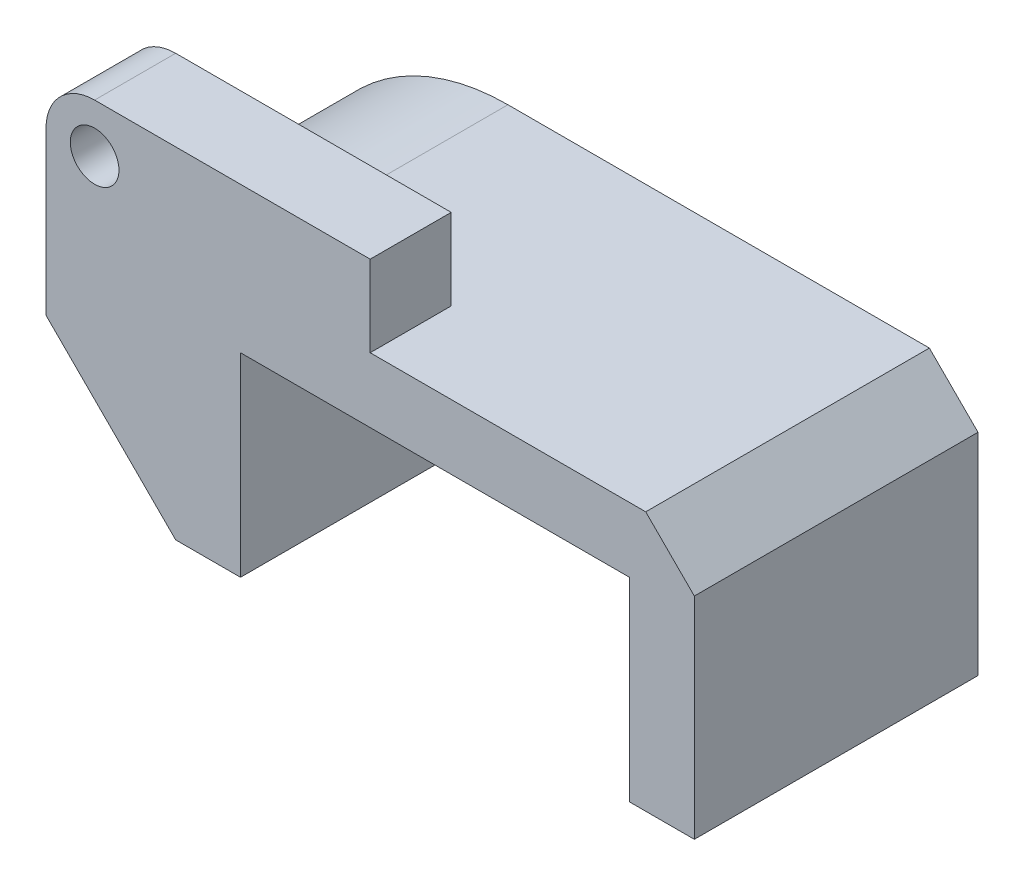
ISO-10303-21;
HEADER;
FILE_DESCRIPTION(('STEP AP214'),'2;1');
FILE_NAME('part.step','',(''),(''),'','','');
FILE_SCHEMA(('AUTOMOTIVE_DESIGN { 1 0 10303 214 1 1 1 1 }'));
ENDSEC;
DATA;
#1=APPLICATION_CONTEXT('core data for automotive mechanical design processes');
#2=APPLICATION_PROTOCOL_DEFINITION('international standard','automotive_design',2000,#1);
#3=PRODUCT_CONTEXT('',#1,'mechanical');
#4=PRODUCT('Part','Part','',(#3));
#5=PRODUCT_RELATED_PRODUCT_CATEGORY('part','',(#4));
#6=PRODUCT_DEFINITION_FORMATION('','',#4);
#7=PRODUCT_DEFINITION_CONTEXT('part definition',#1,'design');
#8=PRODUCT_DEFINITION('design','',#6,#7);
#9=PRODUCT_DEFINITION_SHAPE('','',#8);
#10=(LENGTH_UNIT() NAMED_UNIT(*) SI_UNIT(.MILLI.,.METRE.));
#11=(NAMED_UNIT(*) PLANE_ANGLE_UNIT() SI_UNIT($,.RADIAN.));
#12=(NAMED_UNIT(*) SI_UNIT($,.STERADIAN.) SOLID_ANGLE_UNIT());
#13=UNCERTAINTY_MEASURE_WITH_UNIT(LENGTH_MEASURE(1.E-05),#10,'distance_accuracy_value','');
#14=(GEOMETRIC_REPRESENTATION_CONTEXT(3) GLOBAL_UNCERTAINTY_ASSIGNED_CONTEXT((#13)) GLOBAL_UNIT_ASSIGNED_CONTEXT((#10,
#11,#12)) REPRESENTATION_CONTEXT('',''));
#15=CARTESIAN_POINT('',(0.,0.,0.));
#16=DIRECTION('',(0.,0.,1.));
#17=DIRECTION('',(1.,0.,0.));
#18=AXIS2_PLACEMENT_3D('',#15,#16,#17);
#19=CARTESIAN_POINT('',(-16.,-12.,17.5));
#20=DIRECTION('',(0.,1.,0.));
#21=DIRECTION('',(0.,0.,1.));
#22=AXIS2_PLACEMENT_3D('',#19,#20,#21);
#23=PLANE('',#22);
#24=DIRECTION('',(1.,0.,0.));
#25=VECTOR('',#24,1.);
#26=CARTESIAN_POINT('',(-16.,-12.,17.5));
#27=LINE('',#26,#25);
#28=CARTESIAN_POINT('',(-16.,-12.,17.5));
#29=VERTEX_POINT('',#28);
#30=CARTESIAN_POINT('',(-12.,-12.,17.5));
#31=VERTEX_POINT('',#30);
#32=EDGE_CURVE('E206',#29,#31,#27,.T.);
#33=ORIENTED_EDGE('',*,*,#32,.F.);
#34=DIRECTION('',(0.,0.,-1.));
#35=VECTOR('',#34,1.);
#36=CARTESIAN_POINT('',(-16.,-12.,17.5));
#37=LINE('',#36,#35);
#38=CARTESIAN_POINT('',(-16.,-12.,0.));
#39=VERTEX_POINT('',#38);
#40=EDGE_CURVE('E251',#29,#39,#37,.T.);
#41=ORIENTED_EDGE('',*,*,#40,.T.);
#42=DIRECTION('',(1.,0.,0.));
#43=VECTOR('',#42,1.);
#44=CARTESIAN_POINT('',(-16.,-12.,0.));
#45=LINE('',#44,#43);
#46=CARTESIAN_POINT('',(-12.,-12.,0.));
#47=VERTEX_POINT('',#46);
#48=EDGE_CURVE('E156',#39,#47,#45,.T.);
#49=ORIENTED_EDGE('',*,*,#48,.T.);
#50=DIRECTION('',(0.,0.,-1.));
#51=VECTOR('',#50,1.);
#52=CARTESIAN_POINT('',(-12.,-12.,17.5));
#53=LINE('',#52,#51);
#54=EDGE_CURVE('E248',#31,#47,#53,.T.);
#55=ORIENTED_EDGE('',*,*,#54,.F.);
#56=EDGE_LOOP('',(#33,#41,#49,#55));
#57=FACE_BOUND('',#56,.T.);
#58=ADVANCED_FACE('F32',(#57),#23,.F.);
#59=CARTESIAN_POINT('',(-12.,-12.,17.5));
#60=DIRECTION('',(-1.,0.,0.));
#61=DIRECTION('',(0.,0.,1.));
#62=AXIS2_PLACEMENT_3D('',#59,#60,#61);
#63=PLANE('',#62);
#64=DIRECTION('',(0.,1.,0.));
#65=VECTOR('',#64,1.);
#66=CARTESIAN_POINT('',(-12.,-12.,0.));
#67=LINE('',#66,#65);
#68=CARTESIAN_POINT('',(-12.,0.,0.));
#69=VERTEX_POINT('',#68);
#70=EDGE_CURVE('E225',#47,#69,#67,.T.);
#71=ORIENTED_EDGE('',*,*,#70,.T.);
#72=DIRECTION('',(0.,0.,-1.));
#73=VECTOR('',#72,1.);
#74=CARTESIAN_POINT('',(-12.,0.,17.5));
#75=LINE('',#74,#73);
#76=CARTESIAN_POINT('',(-12.,0.,17.5));
#77=VERTEX_POINT('',#76);
#78=EDGE_CURVE('E245',#77,#69,#75,.T.);
#79=ORIENTED_EDGE('',*,*,#78,.F.);
#80=DIRECTION('',(0.,1.,0.));
#81=VECTOR('',#80,1.);
#82=CARTESIAN_POINT('',(-12.,-12.,17.5));
#83=LINE('',#82,#81);
#84=EDGE_CURVE('E208',#31,#77,#83,.T.);
#85=ORIENTED_EDGE('',*,*,#84,.F.);
#86=ORIENTED_EDGE('',*,*,#54,.T.);
#87=EDGE_LOOP('',(#71,#79,#85,#86));
#88=FACE_BOUND('',#87,.T.);
#89=ADVANCED_FACE('F321',(#88),#63,.F.);
#90=CARTESIAN_POINT('',(-12.,0.,17.5));
#91=DIRECTION('',(0.,1.,0.));
#92=DIRECTION('',(0.,0.,1.));
#93=AXIS2_PLACEMENT_3D('',#90,#91,#92);
#94=PLANE('',#93);
#95=DIRECTION('',(1.,0.,0.));
#96=VECTOR('',#95,1.);
#97=CARTESIAN_POINT('',(-12.,0.,0.));
#98=LINE('',#97,#96);
#99=CARTESIAN_POINT('',(12.,0.,0.));
#100=VERTEX_POINT('',#99);
#101=EDGE_CURVE('E227',#69,#100,#98,.T.);
#102=ORIENTED_EDGE('',*,*,#101,.T.);
#103=DIRECTION('',(0.,0.,-1.));
#104=VECTOR('',#103,1.);
#105=CARTESIAN_POINT('',(12.,0.,17.5));
#106=LINE('',#105,#104);
#107=CARTESIAN_POINT('',(12.,0.,17.5));
#108=VERTEX_POINT('',#107);
#109=EDGE_CURVE('E242',#108,#100,#106,.T.);
#110=ORIENTED_EDGE('',*,*,#109,.F.);
#111=DIRECTION('',(1.,0.,0.));
#112=VECTOR('',#111,1.);
#113=CARTESIAN_POINT('',(-12.,0.,17.5));
#114=LINE('',#113,#112);
#115=EDGE_CURVE('E211',#77,#108,#114,.T.);
#116=ORIENTED_EDGE('',*,*,#115,.F.);
#117=ORIENTED_EDGE('',*,*,#78,.T.);
#118=EDGE_LOOP('',(#102,#110,#116,#117));
#119=FACE_BOUND('',#118,.T.);
#120=ADVANCED_FACE('F317',(#119),#94,.F.);
#121=CARTESIAN_POINT('',(12.,-12.,17.5));
#122=DIRECTION('',(1.,0.,0.));
#123=DIRECTION('',(0.,0.,-1.));
#124=AXIS2_PLACEMENT_3D('',#121,#122,#123);
#125=PLANE('',#124);
#126=DIRECTION('',(0.,-1.,0.));
#127=VECTOR('',#126,1.);
#128=CARTESIAN_POINT('',(12.,-12.,0.));
#129=LINE('',#128,#127);
#130=CARTESIAN_POINT('',(12.,-12.,0.));
#131=VERTEX_POINT('',#130);
#132=EDGE_CURVE('E229',#100,#131,#129,.T.);
#133=ORIENTED_EDGE('',*,*,#132,.T.);
#134=DIRECTION('',(0.,0.,-1.));
#135=VECTOR('',#134,1.);
#136=CARTESIAN_POINT('',(12.,-12.,17.5));
#137=LINE('',#136,#135);
#138=CARTESIAN_POINT('',(12.,-12.,17.5));
#139=VERTEX_POINT('',#138);
#140=EDGE_CURVE('E239',#139,#131,#137,.T.);
#141=ORIENTED_EDGE('',*,*,#140,.F.);
#142=DIRECTION('',(0.,-1.,0.));
#143=VECTOR('',#142,1.);
#144=CARTESIAN_POINT('',(12.,-12.,17.5));
#145=LINE('',#144,#143);
#146=EDGE_CURVE('E213',#108,#139,#145,.T.);
#147=ORIENTED_EDGE('',*,*,#146,.F.);
#148=ORIENTED_EDGE('',*,*,#109,.T.);
#149=EDGE_LOOP('',(#133,#141,#147,#148));
#150=FACE_BOUND('',#149,.T.);
#151=ADVANCED_FACE('F313',(#150),#125,.F.);
#152=CARTESIAN_POINT('',(12.,-12.,17.5));
#153=DIRECTION('',(0.,1.,0.));
#154=DIRECTION('',(0.,0.,1.));
#155=AXIS2_PLACEMENT_3D('',#152,#153,#154);
#156=PLANE('',#155);
#157=DIRECTION('',(1.,0.,0.));
#158=VECTOR('',#157,1.);
#159=CARTESIAN_POINT('',(12.,-12.,0.));
#160=LINE('',#159,#158);
#161=CARTESIAN_POINT('',(16.,-12.,0.));
#162=VERTEX_POINT('',#161);
#163=EDGE_CURVE('E231',#131,#162,#160,.T.);
#164=ORIENTED_EDGE('',*,*,#163,.T.);
#165=DIRECTION('',(0.,0.,-1.));
#166=VECTOR('',#165,1.);
#167=CARTESIAN_POINT('',(16.,-12.,17.5));
#168=LINE('',#167,#166);
#169=CARTESIAN_POINT('',(16.,-12.,17.5));
#170=VERTEX_POINT('',#169);
#171=EDGE_CURVE('E223',#170,#162,#168,.T.);
#172=ORIENTED_EDGE('',*,*,#171,.F.);
#173=DIRECTION('',(1.,0.,0.));
#174=VECTOR('',#173,1.);
#175=CARTESIAN_POINT('',(12.,-12.,17.5));
#176=LINE('',#175,#174);
#177=EDGE_CURVE('E215',#139,#170,#176,.T.);
#178=ORIENTED_EDGE('',*,*,#177,.F.);
#179=ORIENTED_EDGE('',*,*,#140,.T.);
#180=EDGE_LOOP('',(#164,#172,#178,#179));
#181=FACE_BOUND('',#180,.T.);
#182=ADVANCED_FACE('F309',(#181),#156,.F.);
#183=CARTESIAN_POINT('',(16.,4.,17.5));
#184=DIRECTION('',(-1.,0.,0.));
#185=DIRECTION('',(0.,0.,1.));
#186=AXIS2_PLACEMENT_3D('',#183,#184,#185);
#187=PLANE('',#186);
#188=DIRECTION('',(0.,1.,0.));
#189=VECTOR('',#188,1.);
#190=CARTESIAN_POINT('',(16.,4.,0.));
#191=LINE('',#190,#189);
#192=CARTESIAN_POINT('',(16.,0.99999999999999,0.));
#193=VERTEX_POINT('',#192);
#194=EDGE_CURVE('E233',#162,#193,#191,.T.);
#195=ORIENTED_EDGE('',*,*,#194,.T.);
#196=DIRECTION('',(0.,0.,1.));
#197=VECTOR('',#196,1.);
#198=CARTESIAN_POINT('',(16.,0.99999999999999,17.5));
#199=LINE('',#198,#197);
#200=CARTESIAN_POINT('',(16.,0.999999999999992,17.5));
#201=VERTEX_POINT('',#200);
#202=EDGE_CURVE('E261',#193,#201,#199,.T.);
#203=ORIENTED_EDGE('',*,*,#202,.T.);
#204=DIRECTION('',(0.,1.,0.));
#205=VECTOR('',#204,1.);
#206=CARTESIAN_POINT('',(16.,4.,17.5));
#207=LINE('',#206,#205);
#208=EDGE_CURVE('E217',#170,#201,#207,.T.);
#209=ORIENTED_EDGE('',*,*,#208,.F.);
#210=ORIENTED_EDGE('',*,*,#171,.T.);
#211=EDGE_LOOP('',(#195,#203,#209,#210));
#212=FACE_BOUND('',#211,.T.);
#213=ADVANCED_FACE('F300',(#212),#187,.F.);
#214=CARTESIAN_POINT('',(-16.,4.,17.5));
#215=DIRECTION('',(0.,-1.,0.));
#216=DIRECTION('',(0.,0.,-1.));
#217=AXIS2_PLACEMENT_3D('',#214,#215,#216);
#218=PLANE('',#217);
#219=DIRECTION('',(1.,0.,0.));
#220=VECTOR('',#219,1.);
#221=CARTESIAN_POINT('',(-16.,4.,12.5));
#222=LINE('',#221,#220);
#223=CARTESIAN_POINT('',(-13.,4.,12.5));
#224=VERTEX_POINT('',#223);
#225=CARTESIAN_POINT('',(-4.,4.,12.5));
#226=VERTEX_POINT('',#225);
#227=EDGE_CURVE('E200',#224,#226,#222,.T.);
#228=ORIENTED_EDGE('',*,*,#227,.T.);
#229=DIRECTION('',(0.,0.,1.));
#230=VECTOR('',#229,1.);
#231=CARTESIAN_POINT('',(-4.,4.,17.5));
#232=LINE('',#231,#230);
#233=CARTESIAN_POINT('',(-4.,4.,17.5));
#234=VERTEX_POINT('',#233);
#235=EDGE_CURVE('E203',#226,#234,#232,.T.);
#236=ORIENTED_EDGE('',*,*,#235,.T.);
#237=DIRECTION('',(-1.,0.,0.));
#238=VECTOR('',#237,1.);
#239=CARTESIAN_POINT('',(-16.,4.,17.5));
#240=LINE('',#239,#238);
#241=CARTESIAN_POINT('',(13.,4.,17.5));
#242=VERTEX_POINT('',#241);
#243=EDGE_CURVE('E220',#242,#234,#240,.T.);
#244=ORIENTED_EDGE('',*,*,#243,.F.);
#245=DIRECTION('',(0.,0.,-1.));
#246=VECTOR('',#245,1.);
#247=CARTESIAN_POINT('',(13.,4.,17.5));
#248=LINE('',#247,#246);
#249=CARTESIAN_POINT('',(13.,4.,0.));
#250=VERTEX_POINT('',#249);
#251=EDGE_CURVE('E256',#242,#250,#248,.T.);
#252=ORIENTED_EDGE('',*,*,#251,.T.);
#253=DIRECTION('',(-1.,0.,0.));
#254=VECTOR('',#253,1.);
#255=CARTESIAN_POINT('',(-16.,4.,0.));
#256=LINE('',#255,#254);
#257=CARTESIAN_POINT('',(-13.,4.,0.));
#258=VERTEX_POINT('',#257);
#259=EDGE_CURVE('E209',#250,#258,#256,.T.);
#260=ORIENTED_EDGE('',*,*,#259,.T.);
#261=DIRECTION('',(0.,0.,1.));
#262=VECTOR('',#261,1.);
#263=CARTESIAN_POINT('',(-13.,4.,17.5));
#264=LINE('',#263,#262);
#265=EDGE_CURVE('E253',#258,#224,#264,.T.);
#266=ORIENTED_EDGE('',*,*,#265,.T.);
#267=EDGE_LOOP('',(#228,#236,#244,#252,#260,#266));
#268=FACE_BOUND('',#267,.T.);
#269=ADVANCED_FACE('F287',(#268),#218,.F.);
#270=CARTESIAN_POINT('',(0.,0.,17.5));
#271=DIRECTION('',(0.,0.,1.));
#272=DIRECTION('',(1.,0.,0.));
#273=AXIS2_PLACEMENT_3D('',#270,#271,#272);
#274=PLANE('',#273);
#275=CARTESIAN_POINT('',(-21.,5.99999999999999,17.5));
#276=DIRECTION('',(0.,0.,1.));
#277=DIRECTION('',(1.,0.,0.));
#278=AXIS2_PLACEMENT_3D('',#275,#276,#277);
#279=CIRCLE('',#278,1.5);
#280=CARTESIAN_POINT('',(-19.5,5.99999999999999,17.5));
#281=VERTEX_POINT('',#280);
#282=EDGE_CURVE('E177',#281,#281,#279,.T.);
#283=ORIENTED_EDGE('',*,*,#282,.F.);
#284=EDGE_LOOP('',(#283));
#285=FACE_BOUND('',#284,.T.);
#286=DIRECTION('',(-1.,0.,0.));
#287=VECTOR('',#286,1.);
#288=CARTESIAN_POINT('',(-16.,8.99999999999999,17.5));
#289=LINE('',#288,#287);
#290=CARTESIAN_POINT('',(-4.,8.99999999999999,17.5));
#291=VERTEX_POINT('',#290);
#292=CARTESIAN_POINT('',(-21.,8.99999999999999,17.5));
#293=VERTEX_POINT('',#292);
#294=EDGE_CURVE('E194',#291,#293,#289,.T.);
#295=ORIENTED_EDGE('',*,*,#294,.T.);
#296=CARTESIAN_POINT('',(-21.,5.99999999999999,17.5));
#297=DIRECTION('',(0.,0.,1.));
#298=DIRECTION('',(1.,0.,0.));
#299=AXIS2_PLACEMENT_3D('',#296,#297,#298);
#300=CIRCLE('',#299,3.);
#301=CARTESIAN_POINT('',(-24.,5.99999999999999,17.5));
#302=VERTEX_POINT('',#301);
#303=EDGE_CURVE('E270',#293,#302,#300,.T.);
#304=ORIENTED_EDGE('',*,*,#303,.T.);
#305=DIRECTION('',(0.,-1.,0.));
#306=VECTOR('',#305,1.);
#307=CARTESIAN_POINT('',(-24.,8.99999999999999,17.5));
#308=LINE('',#307,#306);
#309=CARTESIAN_POINT('',(-24.,-3.99999999999999,17.5));
#310=VERTEX_POINT('',#309);
#311=EDGE_CURVE('E186',#302,#310,#308,.T.);
#312=ORIENTED_EDGE('',*,*,#311,.T.);
#313=DIRECTION('',(0.707106781186549,-0.707106781186546,0.));
#314=VECTOR('',#313,1.);
#315=CARTESIAN_POINT('',(-14.,-14.,17.5));
#316=LINE('',#315,#314);
#317=EDGE_CURVE('E144',#310,#29,#316,.T.);
#318=ORIENTED_EDGE('',*,*,#317,.T.);
#319=ORIENTED_EDGE('',*,*,#32,.T.);
#320=ORIENTED_EDGE('',*,*,#84,.T.);
#321=ORIENTED_EDGE('',*,*,#115,.T.);
#322=ORIENTED_EDGE('',*,*,#146,.T.);
#323=ORIENTED_EDGE('',*,*,#177,.T.);
#324=ORIENTED_EDGE('',*,*,#208,.T.);
#325=DIRECTION('',(0.707106781186546,-0.707106781186549,0.));
#326=VECTOR('',#325,1.);
#327=CARTESIAN_POINT('',(8.50000000000002,8.49999999999999,17.5));
#328=LINE('',#327,#326);
#329=EDGE_CURVE('E146',#201,#242,#328,.F.);
#330=ORIENTED_EDGE('',*,*,#329,.T.);
#331=ORIENTED_EDGE('',*,*,#243,.T.);
#332=DIRECTION('',(0.,1.,0.));
#333=VECTOR('',#332,1.);
#334=CARTESIAN_POINT('',(-4.,0.999999999999992,17.5));
#335=LINE('',#334,#333);
#336=EDGE_CURVE('E192',#234,#291,#335,.T.);
#337=ORIENTED_EDGE('',*,*,#336,.T.);
#338=EDGE_LOOP('',(#295,#304,#312,#318,#319,#320,#321,#322,#323,#324,#330,#331,#337));
#339=FACE_BOUND('',#338,.T.);
#340=ADVANCED_FACE('F272',(#285,#339),#274,.T.);
#341=CARTESIAN_POINT('',(0.,0.,0.));
#342=DIRECTION('',(0.,0.,1.));
#343=DIRECTION('',(1.,0.,0.));
#344=AXIS2_PLACEMENT_3D('',#341,#342,#343);
#345=PLANE('',#344);
#346=ORIENTED_EDGE('',*,*,#48,.F.);
#347=DIRECTION('',(-0.707106781186547,0.707106781186548,0.));
#348=VECTOR('',#347,1.);
#349=CARTESIAN_POINT('',(-16.,-12.,0.));
#350=LINE('',#349,#348);
#351=CARTESIAN_POINT('',(-24.,-3.99999999999999,0.));
#352=VERTEX_POINT('',#351);
#353=EDGE_CURVE('E142',#39,#352,#350,.T.);
#354=ORIENTED_EDGE('',*,*,#353,.T.);
#355=DIRECTION('',(0.,1.,0.));
#356=VECTOR('',#355,1.);
#357=CARTESIAN_POINT('',(-24.,-3.99999999999999,0.));
#358=LINE('',#357,#356);
#359=CARTESIAN_POINT('',(-24.,-2.,0.));
#360=VERTEX_POINT('',#359);
#361=EDGE_CURVE('E154',#352,#360,#358,.T.);
#362=ORIENTED_EDGE('',*,*,#361,.T.);
#363=CARTESIAN_POINT('',(-13.,-9.08333333333337,0.));
#364=DIRECTION('',(0.,0.,-1.));
#365=DIRECTION('',(1.,0.,0.));
#366=AXIS2_PLACEMENT_3D('',#363,#364,#365);
#367=CIRCLE('',#366,13.0833333333334);
#368=EDGE_CURVE('E157',#360,#258,#367,.T.);
#369=ORIENTED_EDGE('',*,*,#368,.T.);
#370=ORIENTED_EDGE('',*,*,#259,.F.);
#371=DIRECTION('',(-0.707106781186546,0.707106781186549,0.));
#372=VECTOR('',#371,1.);
#373=CARTESIAN_POINT('',(13.,4.,0.));
#374=LINE('',#373,#372);
#375=EDGE_CURVE('E259',#250,#193,#374,.F.);
#376=ORIENTED_EDGE('',*,*,#375,.T.);
#377=ORIENTED_EDGE('',*,*,#194,.F.);
#378=ORIENTED_EDGE('',*,*,#163,.F.);
#379=ORIENTED_EDGE('',*,*,#132,.F.);
#380=ORIENTED_EDGE('',*,*,#101,.F.);
#381=ORIENTED_EDGE('',*,*,#70,.F.);
#382=EDGE_LOOP('',(#346,#354,#362,#369,#370,#376,#377,#378,#379,#380,#381));
#383=FACE_BOUND('',#382,.T.);
#384=CARTESIAN_POINT('',(-14.5,-6.,0.));
#385=DIRECTION('',(0.,0.,-1.));
#386=DIRECTION('',(-1.,0.,0.));
#387=AXIS2_PLACEMENT_3D('',#384,#385,#386);
#388=CIRCLE('',#387,1.);
#389=CARTESIAN_POINT('',(-15.5,-6.,0.));
#390=VERTEX_POINT('',#389);
#391=EDGE_CURVE('E171',#390,#390,#388,.T.);
#392=ORIENTED_EDGE('',*,*,#391,.F.);
#393=EDGE_LOOP('',(#392));
#394=FACE_BOUND('',#393,.T.);
#395=CARTESIAN_POINT('',(14.5,-6.,0.));
#396=DIRECTION('',(0.,0.,-1.));
#397=DIRECTION('',(-1.,0.,0.));
#398=AXIS2_PLACEMENT_3D('',#395,#396,#397);
#399=CIRCLE('',#398,1.);
#400=CARTESIAN_POINT('',(13.5,-6.,0.));
#401=VERTEX_POINT('',#400);
#402=EDGE_CURVE('E170',#401,#401,#399,.T.);
#403=ORIENTED_EDGE('',*,*,#402,.F.);
#404=EDGE_LOOP('',(#403));
#405=FACE_BOUND('',#404,.T.);
#406=ADVANCED_FACE('F151',(#383,#394,#405),#345,.F.);
#407=CARTESIAN_POINT('',(13.,4.,17.5));
#408=DIRECTION('',(-0.707106781186549,-0.707106781186546,0.));
#409=DIRECTION('',(0.,0.,-1.));
#410=AXIS2_PLACEMENT_3D('',#407,#408,#409);
#411=PLANE('',#410);
#412=ORIENTED_EDGE('',*,*,#329,.F.);
#413=ORIENTED_EDGE('',*,*,#202,.F.);
#414=ORIENTED_EDGE('',*,*,#375,.F.);
#415=ORIENTED_EDGE('',*,*,#251,.F.);
#416=EDGE_LOOP('',(#412,#413,#414,#415));
#417=FACE_BOUND('',#416,.T.);
#418=ADVANCED_FACE('F304',(#417),#411,.F.);
#419=CARTESIAN_POINT('',(-4.,0.999999999999992,12.5));
#420=DIRECTION('',(1.,0.,0.));
#421=DIRECTION('',(0.,0.,-1.));
#422=AXIS2_PLACEMENT_3D('',#419,#420,#421);
#423=PLANE('',#422);
#424=ORIENTED_EDGE('',*,*,#235,.F.);
#425=DIRECTION('',(0.,1.,0.));
#426=VECTOR('',#425,1.);
#427=CARTESIAN_POINT('',(-4.,0.999999999999992,12.5));
#428=LINE('',#427,#426);
#429=CARTESIAN_POINT('',(-4.,8.99999999999999,12.5));
#430=VERTEX_POINT('',#429);
#431=EDGE_CURVE('E183',#226,#430,#428,.T.);
#432=ORIENTED_EDGE('',*,*,#431,.T.);
#433=DIRECTION('',(0.,0.,1.));
#434=VECTOR('',#433,1.);
#435=CARTESIAN_POINT('',(-4.,8.99999999999999,12.5));
#436=LINE('',#435,#434);
#437=EDGE_CURVE('E191',#430,#291,#436,.T.);
#438=ORIENTED_EDGE('',*,*,#437,.T.);
#439=ORIENTED_EDGE('',*,*,#336,.F.);
#440=EDGE_LOOP('',(#424,#432,#438,#439));
#441=FACE_BOUND('',#440,.T.);
#442=ADVANCED_FACE('F285',(#441),#423,.T.);
#443=CARTESIAN_POINT('',(0.,0.,12.5));
#444=DIRECTION('',(0.,0.,-1.));
#445=DIRECTION('',(-1.,0.,0.));
#446=AXIS2_PLACEMENT_3D('',#443,#444,#445);
#447=PLANE('',#446);
#448=CARTESIAN_POINT('',(-13.,-9.08333333333337,12.5));
#449=DIRECTION('',(0.,0.,-1.));
#450=DIRECTION('',(-1.,0.,0.));
#451=AXIS2_PLACEMENT_3D('',#448,#449,#450);
#452=CIRCLE('',#451,13.0833333333334);
#453=CARTESIAN_POINT('',(-24.,-1.99999999999999,12.5));
#454=VERTEX_POINT('',#453);
#455=EDGE_CURVE('E47',#224,#454,#452,.F.);
#456=ORIENTED_EDGE('',*,*,#455,.T.);
#457=DIRECTION('',(0.,-1.,0.));
#458=VECTOR('',#457,1.);
#459=CARTESIAN_POINT('',(-24.,8.99999999999999,12.5));
#460=LINE('',#459,#458);
#461=CARTESIAN_POINT('',(-24.,5.99999999999999,12.5));
#462=VERTEX_POINT('',#461);
#463=EDGE_CURVE('E189',#462,#454,#460,.T.);
#464=ORIENTED_EDGE('',*,*,#463,.F.);
#465=CARTESIAN_POINT('',(-21.,5.99999999999999,12.5));
#466=DIRECTION('',(0.,0.,-1.));
#467=DIRECTION('',(-1.,0.,0.));
#468=AXIS2_PLACEMENT_3D('',#465,#466,#467);
#469=CIRCLE('',#468,3.);
#470=CARTESIAN_POINT('',(-21.,8.99999999999999,12.5));
#471=VERTEX_POINT('',#470);
#472=EDGE_CURVE('E11',#462,#471,#469,.T.);
#473=ORIENTED_EDGE('',*,*,#472,.T.);
#474=DIRECTION('',(-1.,0.,0.));
#475=VECTOR('',#474,1.);
#476=CARTESIAN_POINT('',(-16.,8.99999999999999,12.5));
#477=LINE('',#476,#475);
#478=EDGE_CURVE('E185',#430,#471,#477,.T.);
#479=ORIENTED_EDGE('',*,*,#478,.F.);
#480=ORIENTED_EDGE('',*,*,#431,.F.);
#481=ORIENTED_EDGE('',*,*,#227,.F.);
#482=EDGE_LOOP('',(#456,#464,#473,#479,#480,#481));
#483=FACE_BOUND('',#482,.T.);
#484=CARTESIAN_POINT('',(-21.,5.99999999999999,12.5));
#485=DIRECTION('',(0.,0.,-1.));
#486=DIRECTION('',(-1.,0.,0.));
#487=AXIS2_PLACEMENT_3D('',#484,#485,#486);
#488=CIRCLE('',#487,1.5);
#489=CARTESIAN_POINT('',(-22.5,5.99999999999999,12.5));
#490=VERTEX_POINT('',#489);
#491=EDGE_CURVE('E182',#490,#490,#488,.T.);
#492=ORIENTED_EDGE('',*,*,#491,.F.);
#493=EDGE_LOOP('',(#492));
#494=FACE_BOUND('',#493,.T.);
#495=ADVANCED_FACE('F278',(#483,#494),#447,.T.);
#496=CARTESIAN_POINT('',(-24.,8.99999999999999,12.5));
#497=DIRECTION('',(-1.,0.,0.));
#498=DIRECTION('',(0.,-1.,0.));
#499=AXIS2_PLACEMENT_3D('',#496,#497,#498);
#500=PLANE('',#499);
#501=ORIENTED_EDGE('',*,*,#311,.F.);
#502=DIRECTION('',(0.,0.,1.));
#503=VECTOR('',#502,1.);
#504=CARTESIAN_POINT('',(-24.,5.99999999999999,12.5));
#505=LINE('',#504,#503);
#506=EDGE_CURVE('E40',#302,#462,#505,.F.);
#507=ORIENTED_EDGE('',*,*,#506,.T.);
#508=ORIENTED_EDGE('',*,*,#463,.T.);
#509=DIRECTION('',(0.,0.,-1.));
#510=VECTOR('',#509,1.);
#511=CARTESIAN_POINT('',(-24.,-2.,31.9164878389476));
#512=LINE('',#511,#510);
#513=EDGE_CURVE('E161',#454,#360,#512,.T.);
#514=ORIENTED_EDGE('',*,*,#513,.T.);
#515=ORIENTED_EDGE('',*,*,#361,.F.);
#516=DIRECTION('',(0.,0.,1.));
#517=VECTOR('',#516,1.);
#518=CARTESIAN_POINT('',(-24.,-4.,17.5));
#519=LINE('',#518,#517);
#520=EDGE_CURVE('E139',#352,#310,#519,.T.);
#521=ORIENTED_EDGE('',*,*,#520,.T.);
#522=EDGE_LOOP('',(#501,#507,#508,#514,#515,#521));
#523=FACE_BOUND('',#522,.T.);
#524=ADVANCED_FACE('F159',(#523),#500,.T.);
#525=CARTESIAN_POINT('',(-16.,8.99999999999999,12.5));
#526=DIRECTION('',(0.,1.,0.));
#527=DIRECTION('',(-1.,0.,0.));
#528=AXIS2_PLACEMENT_3D('',#525,#526,#527);
#529=PLANE('',#528);
#530=ORIENTED_EDGE('',*,*,#478,.T.);
#531=DIRECTION('',(0.,0.,1.));
#532=VECTOR('',#531,1.);
#533=CARTESIAN_POINT('',(-21.,8.99999999999999,12.5));
#534=LINE('',#533,#532);
#535=EDGE_CURVE('E265',#471,#293,#534,.T.);
#536=ORIENTED_EDGE('',*,*,#535,.T.);
#537=ORIENTED_EDGE('',*,*,#294,.F.);
#538=ORIENTED_EDGE('',*,*,#437,.F.);
#539=EDGE_LOOP('',(#530,#536,#537,#538));
#540=FACE_BOUND('',#539,.T.);
#541=ADVANCED_FACE('F283',(#540),#529,.T.);
#542=CARTESIAN_POINT('',(-24.,-4.,12.5));
#543=DIRECTION('',(-0.707106781186546,-0.707106781186549,0.));
#544=DIRECTION('',(0.,0.,-1.));
#545=AXIS2_PLACEMENT_3D('',#542,#543,#544);
#546=PLANE('',#545);
#547=ORIENTED_EDGE('',*,*,#520,.F.);
#548=ORIENTED_EDGE('',*,*,#353,.F.);
#549=ORIENTED_EDGE('',*,*,#40,.F.);
#550=ORIENTED_EDGE('',*,*,#317,.F.);
#551=EDGE_LOOP('',(#547,#548,#549,#550));
#552=FACE_BOUND('',#551,.T.);
#553=ADVANCED_FACE('F141',(#552),#546,.T.);
#554=CARTESIAN_POINT('',(-21.,5.99999999999999,0.));
#555=DIRECTION('',(0.,0.,1.));
#556=DIRECTION('',(1.,0.,0.));
#557=AXIS2_PLACEMENT_3D('',#554,#555,#556);
#558=CYLINDRICAL_SURFACE('',#557,1.5);
#559=ORIENTED_EDGE('',*,*,#491,.T.);
#560=EDGE_LOOP('',(#559));
#561=FACE_BOUND('',#560,.T.);
#562=ORIENTED_EDGE('',*,*,#282,.T.);
#563=EDGE_LOOP('',(#562));
#564=FACE_BOUND('',#563,.T.);
#565=ADVANCED_FACE('F335',(#561,#564),#558,.F.);
#566=CARTESIAN_POINT('',(-21.,5.99999999999999,12.5));
#567=DIRECTION('',(0.,0.,1.));
#568=DIRECTION('',(1.,0.,0.));
#569=AXIS2_PLACEMENT_3D('',#566,#567,#568);
#570=CYLINDRICAL_SURFACE('',#569,3.);
#571=ORIENTED_EDGE('',*,*,#472,.F.);
#572=ORIENTED_EDGE('',*,*,#506,.F.);
#573=ORIENTED_EDGE('',*,*,#303,.F.);
#574=ORIENTED_EDGE('',*,*,#535,.F.);
#575=EDGE_LOOP('',(#571,#572,#573,#574));
#576=FACE_BOUND('',#575,.T.);
#577=ADVANCED_FACE('F34',(#576),#570,.T.);
#578=CARTESIAN_POINT('',(14.5,-6.,8.));
#579=DIRECTION('',(0.,0.,-1.));
#580=DIRECTION('',(-1.,0.,0.));
#581=AXIS2_PLACEMENT_3D('',#578,#579,#580);
#582=CYLINDRICAL_SURFACE('',#581,1.);
#583=CARTESIAN_POINT('',(14.5,-6.,8.));
#584=DIRECTION('',(0.,0.,-1.));
#585=DIRECTION('',(-1.,0.,0.));
#586=AXIS2_PLACEMENT_3D('',#583,#584,#585);
#587=CIRCLE('',#586,1.);
#588=CARTESIAN_POINT('',(13.5,-6.,8.));
#589=VERTEX_POINT('',#588);
#590=EDGE_CURVE('E174',#589,#589,#587,.T.);
#591=ORIENTED_EDGE('',*,*,#590,.F.);
#592=EDGE_LOOP('',(#591));
#593=FACE_BOUND('',#592,.T.);
#594=ORIENTED_EDGE('',*,*,#402,.T.);
#595=EDGE_LOOP('',(#594));
#596=FACE_BOUND('',#595,.T.);
#597=ADVANCED_FACE('F449',(#593,#596),#582,.F.);
#598=CARTESIAN_POINT('',(14.5,-6.,8.));
#599=DIRECTION('',(0.,0.,-1.));
#600=DIRECTION('',(-1.,0.,0.));
#601=AXIS2_PLACEMENT_3D('',#598,#599,#600);
#602=PLANE('',#601);
#603=ORIENTED_EDGE('',*,*,#590,.T.);
#604=EDGE_LOOP('',(#603));
#605=FACE_BOUND('',#604,.T.);
#606=ADVANCED_FACE('F441',(#605),#602,.T.);
#607=CARTESIAN_POINT('',(-14.5,-6.,8.));
#608=DIRECTION('',(0.,0.,-1.));
#609=DIRECTION('',(-1.,0.,0.));
#610=AXIS2_PLACEMENT_3D('',#607,#608,#609);
#611=CYLINDRICAL_SURFACE('',#610,1.);
#612=CARTESIAN_POINT('',(-14.5,-6.,8.));
#613=DIRECTION('',(0.,0.,-1.));
#614=DIRECTION('',(-1.,0.,0.));
#615=AXIS2_PLACEMENT_3D('',#612,#613,#614);
#616=CIRCLE('',#615,1.);
#617=CARTESIAN_POINT('',(-15.5,-6.,8.));
#618=VERTEX_POINT('',#617);
#619=EDGE_CURVE('E167',#618,#618,#616,.T.);
#620=ORIENTED_EDGE('',*,*,#619,.F.);
#621=EDGE_LOOP('',(#620));
#622=FACE_BOUND('',#621,.T.);
#623=ORIENTED_EDGE('',*,*,#391,.T.);
#624=EDGE_LOOP('',(#623));
#625=FACE_BOUND('',#624,.T.);
#626=ADVANCED_FACE('F433',(#622,#625),#611,.F.);
#627=CARTESIAN_POINT('',(-14.5,-6.,8.));
#628=DIRECTION('',(0.,0.,-1.));
#629=DIRECTION('',(-1.,0.,0.));
#630=AXIS2_PLACEMENT_3D('',#627,#628,#629);
#631=PLANE('',#630);
#632=ORIENTED_EDGE('',*,*,#619,.T.);
#633=EDGE_LOOP('',(#632));
#634=FACE_BOUND('',#633,.T.);
#635=ADVANCED_FACE('F424',(#634),#631,.T.);
#636=CARTESIAN_POINT('',(-13.,-9.08333333333337,31.9164878389476));
#637=DIRECTION('',(0.,0.,-1.));
#638=DIRECTION('',(-1.,0.,0.));
#639=AXIS2_PLACEMENT_3D('',#636,#637,#638);
#640=CYLINDRICAL_SURFACE('',#639,13.0833333333334);
#641=ORIENTED_EDGE('',*,*,#455,.F.);
#642=ORIENTED_EDGE('',*,*,#265,.F.);
#643=ORIENTED_EDGE('',*,*,#368,.F.);
#644=ORIENTED_EDGE('',*,*,#513,.F.);
#645=EDGE_LOOP('',(#641,#642,#643,#644));
#646=FACE_BOUND('',#645,.T.);
#647=ADVANCED_FACE('F292',(#646),#640,.T.);
#648=CLOSED_SHELL('',(#58,#89,#120,#151,#182,#213,#269,#340,#406,#418,#442,#495,#524,#541,#553,
#565,#577,#597,#606,#626,#635,#647));
#649=MANIFOLD_SOLID_BREP('B2',#648);
#650=ADVANCED_BREP_SHAPE_REPRESENTATION('',(#18,#649),#14);
#651=SHAPE_DEFINITION_REPRESENTATION(#9,#650);
ENDSEC;
END-ISO-10303-21;
